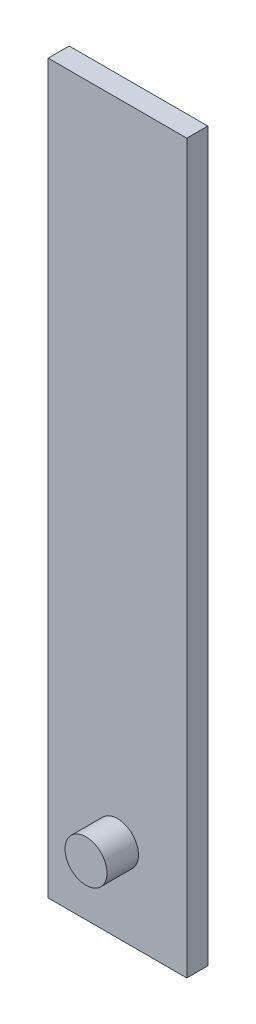
ISO-10303-21;
HEADER;
FILE_DESCRIPTION(('STEP AP214'),'2;1');
FILE_NAME('part.step','',(''),(''),'','','');
FILE_SCHEMA(('AUTOMOTIVE_DESIGN { 1 0 10303 214 1 1 1 1 }'));
ENDSEC;
DATA;
#1=APPLICATION_CONTEXT('core data for automotive mechanical design processes');
#2=APPLICATION_PROTOCOL_DEFINITION('international standard','automotive_design',2000,#1);
#3=PRODUCT_CONTEXT('',#1,'mechanical');
#4=PRODUCT('Part','Part','',(#3));
#5=PRODUCT_RELATED_PRODUCT_CATEGORY('part','',(#4));
#6=PRODUCT_DEFINITION_FORMATION('','',#4);
#7=PRODUCT_DEFINITION_CONTEXT('part definition',#1,'design');
#8=PRODUCT_DEFINITION('design','',#6,#7);
#9=PRODUCT_DEFINITION_SHAPE('','',#8);
#10=(LENGTH_UNIT() NAMED_UNIT(*) SI_UNIT(.MILLI.,.METRE.));
#11=(NAMED_UNIT(*) PLANE_ANGLE_UNIT() SI_UNIT($,.RADIAN.));
#12=(NAMED_UNIT(*) SI_UNIT($,.STERADIAN.) SOLID_ANGLE_UNIT());
#13=UNCERTAINTY_MEASURE_WITH_UNIT(LENGTH_MEASURE(1.E-05),#10,'distance_accuracy_value','');
#14=(GEOMETRIC_REPRESENTATION_CONTEXT(3) GLOBAL_UNCERTAINTY_ASSIGNED_CONTEXT((#13)) GLOBAL_UNIT_ASSIGNED_CONTEXT((#10,
#11,#12)) REPRESENTATION_CONTEXT('',''));
#15=CARTESIAN_POINT('',(0.,0.,0.));
#16=DIRECTION('',(0.,0.,1.));
#17=DIRECTION('',(1.,0.,0.));
#18=AXIS2_PLACEMENT_3D('',#15,#16,#17);
#19=CARTESIAN_POINT('',(6.59983737568734,-34.6381930496557,2.));
#20=DIRECTION('',(-1.,0.,0.));
#21=DIRECTION('',(0.,0.,1.));
#22=AXIS2_PLACEMENT_3D('',#19,#20,#21);
#23=PLANE('',#22);
#24=DIRECTION('',(0.,1.,0.));
#25=VECTOR('',#24,1.);
#26=CARTESIAN_POINT('',(6.59983737568734,-34.6381930496557,0.));
#27=LINE('',#26,#25);
#28=CARTESIAN_POINT('',(6.59983737568734,-34.6381930496557,0.));
#29=VERTEX_POINT('',#28);
#30=CARTESIAN_POINT('',(6.59983737568734,34.6381930496557,0.));
#31=VERTEX_POINT('',#30);
#32=EDGE_CURVE('E110',#29,#31,#27,.T.);
#33=ORIENTED_EDGE('',*,*,#32,.T.);
#34=DIRECTION('',(0.,0.,-1.));
#35=VECTOR('',#34,1.);
#36=CARTESIAN_POINT('',(6.59983737568734,34.6381930496557,2.));
#37=LINE('',#36,#35);
#38=CARTESIAN_POINT('',(6.59983737568734,34.6381930496557,2.));
#39=VERTEX_POINT('',#38);
#40=EDGE_CURVE('E47',#39,#31,#37,.T.);
#41=ORIENTED_EDGE('',*,*,#40,.F.);
#42=DIRECTION('',(0.,1.,0.));
#43=VECTOR('',#42,1.);
#44=CARTESIAN_POINT('',(6.59983737568734,-34.6381930496557,2.));
#45=LINE('',#44,#43);
#46=CARTESIAN_POINT('',(6.59983737568734,-34.6381930496557,2.));
#47=VERTEX_POINT('',#46);
#48=EDGE_CURVE('E91',#47,#39,#45,.T.);
#49=ORIENTED_EDGE('',*,*,#48,.F.);
#50=DIRECTION('',(0.,0.,-1.));
#51=VECTOR('',#50,1.);
#52=CARTESIAN_POINT('',(6.59983737568734,-34.6381930496557,2.));
#53=LINE('',#52,#51);
#54=EDGE_CURVE('E103',#47,#29,#53,.T.);
#55=ORIENTED_EDGE('',*,*,#54,.T.);
#56=EDGE_LOOP('',(#33,#41,#49,#55));
#57=FACE_BOUND('',#56,.T.);
#58=ADVANCED_FACE('F41',(#57),#23,.F.);
#59=CARTESIAN_POINT('',(-6.59983737568734,34.6381930496557,2.));
#60=DIRECTION('',(0.,-1.,0.));
#61=DIRECTION('',(0.,0.,-1.));
#62=AXIS2_PLACEMENT_3D('',#59,#60,#61);
#63=PLANE('',#62);
#64=DIRECTION('',(-1.,0.,0.));
#65=VECTOR('',#64,1.);
#66=CARTESIAN_POINT('',(-6.59983737568734,34.6381930496557,0.));
#67=LINE('',#66,#65);
#68=CARTESIAN_POINT('',(-6.59983737568734,34.6381930496557,0.));
#69=VERTEX_POINT('',#68);
#70=EDGE_CURVE('E98',#31,#69,#67,.T.);
#71=ORIENTED_EDGE('',*,*,#70,.T.);
#72=DIRECTION('',(0.,0.,-1.));
#73=VECTOR('',#72,1.);
#74=CARTESIAN_POINT('',(-6.59983737568734,34.6381930496557,2.));
#75=LINE('',#74,#73);
#76=CARTESIAN_POINT('',(-6.59983737568734,34.6381930496557,2.));
#77=VERTEX_POINT('',#76);
#78=EDGE_CURVE('E96',#77,#69,#75,.T.);
#79=ORIENTED_EDGE('',*,*,#78,.F.);
#80=DIRECTION('',(-1.,0.,0.));
#81=VECTOR('',#80,1.);
#82=CARTESIAN_POINT('',(-6.59983737568734,34.6381930496557,2.));
#83=LINE('',#82,#81);
#84=EDGE_CURVE('E86',#39,#77,#83,.T.);
#85=ORIENTED_EDGE('',*,*,#84,.F.);
#86=ORIENTED_EDGE('',*,*,#40,.T.);
#87=EDGE_LOOP('',(#71,#79,#85,#86));
#88=FACE_BOUND('',#87,.T.);
#89=ADVANCED_FACE('F100',(#88),#63,.F.);
#90=CARTESIAN_POINT('',(-6.59983737568734,-34.6381930496557,2.));
#91=DIRECTION('',(1.,0.,0.));
#92=DIRECTION('',(0.,0.,-1.));
#93=AXIS2_PLACEMENT_3D('',#90,#91,#92);
#94=PLANE('',#93);
#95=DIRECTION('',(0.,-1.,0.));
#96=VECTOR('',#95,1.);
#97=CARTESIAN_POINT('',(-6.59983737568734,-34.6381930496557,0.));
#98=LINE('',#97,#96);
#99=CARTESIAN_POINT('',(-6.59983737568734,-34.6381930496557,0.));
#100=VERTEX_POINT('',#99);
#101=EDGE_CURVE('E74',#69,#100,#98,.T.);
#102=ORIENTED_EDGE('',*,*,#101,.T.);
#103=DIRECTION('',(0.,0.,-1.));
#104=VECTOR('',#103,1.);
#105=CARTESIAN_POINT('',(-6.59983737568734,-34.6381930496557,2.));
#106=LINE('',#105,#104);
#107=CARTESIAN_POINT('',(-6.59983737568734,-34.6381930496557,2.));
#108=VERTEX_POINT('',#107);
#109=EDGE_CURVE('E97',#108,#100,#106,.T.);
#110=ORIENTED_EDGE('',*,*,#109,.F.);
#111=DIRECTION('',(0.,-1.,0.));
#112=VECTOR('',#111,1.);
#113=CARTESIAN_POINT('',(-6.59983737568734,-34.6381930496557,2.));
#114=LINE('',#113,#112);
#115=EDGE_CURVE('E93',#77,#108,#114,.T.);
#116=ORIENTED_EDGE('',*,*,#115,.F.);
#117=ORIENTED_EDGE('',*,*,#78,.T.);
#118=EDGE_LOOP('',(#102,#110,#116,#117));
#119=FACE_BOUND('',#118,.T.);
#120=ADVANCED_FACE('F101',(#119),#94,.F.);
#121=CARTESIAN_POINT('',(-6.59983737568734,-34.6381930496557,2.));
#122=DIRECTION('',(0.,1.,0.));
#123=DIRECTION('',(0.,0.,1.));
#124=AXIS2_PLACEMENT_3D('',#121,#122,#123);
#125=PLANE('',#124);
#126=DIRECTION('',(1.,0.,0.));
#127=VECTOR('',#126,1.);
#128=CARTESIAN_POINT('',(-6.59983737568734,-34.6381930496557,0.));
#129=LINE('',#128,#127);
#130=EDGE_CURVE('E76',#100,#29,#129,.T.);
#131=ORIENTED_EDGE('',*,*,#130,.T.);
#132=ORIENTED_EDGE('',*,*,#54,.F.);
#133=DIRECTION('',(1.,0.,0.));
#134=VECTOR('',#133,1.);
#135=CARTESIAN_POINT('',(-6.59983737568734,-34.6381930496557,2.));
#136=LINE('',#135,#134);
#137=EDGE_CURVE('E60',#108,#47,#136,.T.);
#138=ORIENTED_EDGE('',*,*,#137,.F.);
#139=ORIENTED_EDGE('',*,*,#109,.T.);
#140=EDGE_LOOP('',(#131,#132,#138,#139));
#141=FACE_BOUND('',#140,.T.);
#142=ADVANCED_FACE('F128',(#141),#125,.F.);
#143=CARTESIAN_POINT('',(0.,0.,2.));
#144=DIRECTION('',(0.,0.,-1.));
#145=DIRECTION('',(-1.,0.,0.));
#146=AXIS2_PLACEMENT_3D('',#143,#144,#145);
#147=PLANE('',#146);
#148=CARTESIAN_POINT('',(0.,-26.7903538175157,2.));
#149=DIRECTION('',(0.,0.,-1.));
#150=DIRECTION('',(-1.,0.,0.));
#151=AXIS2_PLACEMENT_3D('',#148,#149,#150);
#152=CIRCLE('',#151,2.00059049618559);
#153=CARTESIAN_POINT('',(-2.00059049618559,-26.7903538175157,2.));
#154=VERTEX_POINT('',#153);
#155=EDGE_CURVE('E109',#154,#154,#152,.T.);
#156=ORIENTED_EDGE('',*,*,#155,.T.);
#157=EDGE_LOOP('',(#156));
#158=FACE_BOUND('',#157,.T.);
#159=ORIENTED_EDGE('',*,*,#48,.T.);
#160=ORIENTED_EDGE('',*,*,#84,.T.);
#161=ORIENTED_EDGE('',*,*,#115,.T.);
#162=ORIENTED_EDGE('',*,*,#137,.T.);
#163=EDGE_LOOP('',(#159,#160,#161,#162));
#164=FACE_BOUND('',#163,.T.);
#165=ADVANCED_FACE('F90',(#158,#164),#147,.F.);
#166=CARTESIAN_POINT('',(0.,0.,0.));
#167=DIRECTION('',(0.,0.,-1.));
#168=DIRECTION('',(-1.,0.,0.));
#169=AXIS2_PLACEMENT_3D('',#166,#167,#168);
#170=PLANE('',#169);
#171=CARTESIAN_POINT('',(0.,-26.7903538175157,0.));
#172=DIRECTION('',(0.,0.,-1.));
#173=DIRECTION('',(-1.,0.,0.));
#174=AXIS2_PLACEMENT_3D('',#171,#172,#173);
#175=CIRCLE('',#174,2.00059049618559);
#176=CARTESIAN_POINT('',(-2.00059049618559,-26.7903538175157,0.));
#177=VERTEX_POINT('',#176);
#178=EDGE_CURVE('E11',#177,#177,#175,.T.);
#179=ORIENTED_EDGE('',*,*,#178,.F.);
#180=EDGE_LOOP('',(#179));
#181=FACE_BOUND('',#180,.T.);
#182=ORIENTED_EDGE('',*,*,#32,.F.);
#183=ORIENTED_EDGE('',*,*,#130,.F.);
#184=ORIENTED_EDGE('',*,*,#101,.F.);
#185=ORIENTED_EDGE('',*,*,#70,.F.);
#186=EDGE_LOOP('',(#182,#183,#184,#185));
#187=FACE_BOUND('',#186,.T.);
#188=ADVANCED_FACE('F117',(#181,#187),#170,.T.);
#189=CARTESIAN_POINT('',(0.,-26.7903538175157,-3.));
#190=DIRECTION('',(0.,0.,1.));
#191=DIRECTION('',(1.,0.,0.));
#192=AXIS2_PLACEMENT_3D('',#189,#190,#191);
#193=PLANE('',#192);
#194=CARTESIAN_POINT('',(0.,-26.7903538175157,-3.));
#195=DIRECTION('',(0.,0.,1.));
#196=DIRECTION('',(1.,0.,0.));
#197=AXIS2_PLACEMENT_3D('',#194,#195,#196);
#198=CIRCLE('',#197,2.00059049618559);
#199=CARTESIAN_POINT('',(2.00059049618559,-26.7903538175157,-3.));
#200=VERTEX_POINT('',#199);
#201=EDGE_CURVE('E196',#200,#200,#198,.T.);
#202=ORIENTED_EDGE('',*,*,#201,.F.);
#203=EDGE_LOOP('',(#202));
#204=FACE_BOUND('',#203,.T.);
#205=ADVANCED_FACE('F116',(#204),#193,.F.);
#206=CARTESIAN_POINT('',(0.,-26.7903538175157,-3.));
#207=DIRECTION('',(0.,0.,1.));
#208=DIRECTION('',(1.,0.,0.));
#209=AXIS2_PLACEMENT_3D('',#206,#207,#208);
#210=CYLINDRICAL_SURFACE('',#209,2.00059049618559);
#211=ORIENTED_EDGE('',*,*,#178,.T.);
#212=EDGE_LOOP('',(#211));
#213=FACE_BOUND('',#212,.T.);
#214=ORIENTED_EDGE('',*,*,#201,.T.);
#215=EDGE_LOOP('',(#214));
#216=FACE_BOUND('',#215,.T.);
#217=ADVANCED_FACE('F130',(#213,#216),#210,.T.);
#218=CARTESIAN_POINT('',(0.,-26.7903538175157,5.));
#219=DIRECTION('',(0.,0.,1.));
#220=DIRECTION('',(1.,0.,0.));
#221=AXIS2_PLACEMENT_3D('',#218,#219,#220);
#222=CIRCLE('',#221,2.00059049618559);
#223=CARTESIAN_POINT('',(2.00059049618559,-26.7903538175157,5.));
#224=VERTEX_POINT('',#223);
#225=EDGE_CURVE('E197',#224,#224,#222,.T.);
#226=ORIENTED_EDGE('',*,*,#225,.F.);
#227=EDGE_LOOP('',(#226));
#228=FACE_BOUND('',#227,.T.);
#229=ORIENTED_EDGE('',*,*,#155,.F.);
#230=EDGE_LOOP('',(#229));
#231=FACE_BOUND('',#230,.T.);
#232=ADVANCED_FACE('F172',(#228,#231),#210,.T.);
#233=CARTESIAN_POINT('',(0.,-26.7903538175157,5.));
#234=DIRECTION('',(0.,0.,1.));
#235=DIRECTION('',(1.,0.,0.));
#236=AXIS2_PLACEMENT_3D('',#233,#234,#235);
#237=PLANE('',#236);
#238=ORIENTED_EDGE('',*,*,#225,.T.);
#239=EDGE_LOOP('',(#238));
#240=FACE_BOUND('',#239,.T.);
#241=ADVANCED_FACE('F181',(#240),#237,.T.);
#242=CLOSED_SHELL('',(#58,#89,#120,#142,#165,#188,#205,#217,#232,#241));
#243=MANIFOLD_SOLID_BREP('B2',#242);
#244=ADVANCED_BREP_SHAPE_REPRESENTATION('',(#18,#243),#14);
#245=SHAPE_DEFINITION_REPRESENTATION(#9,#244);
ENDSEC;
END-ISO-10303-21;
